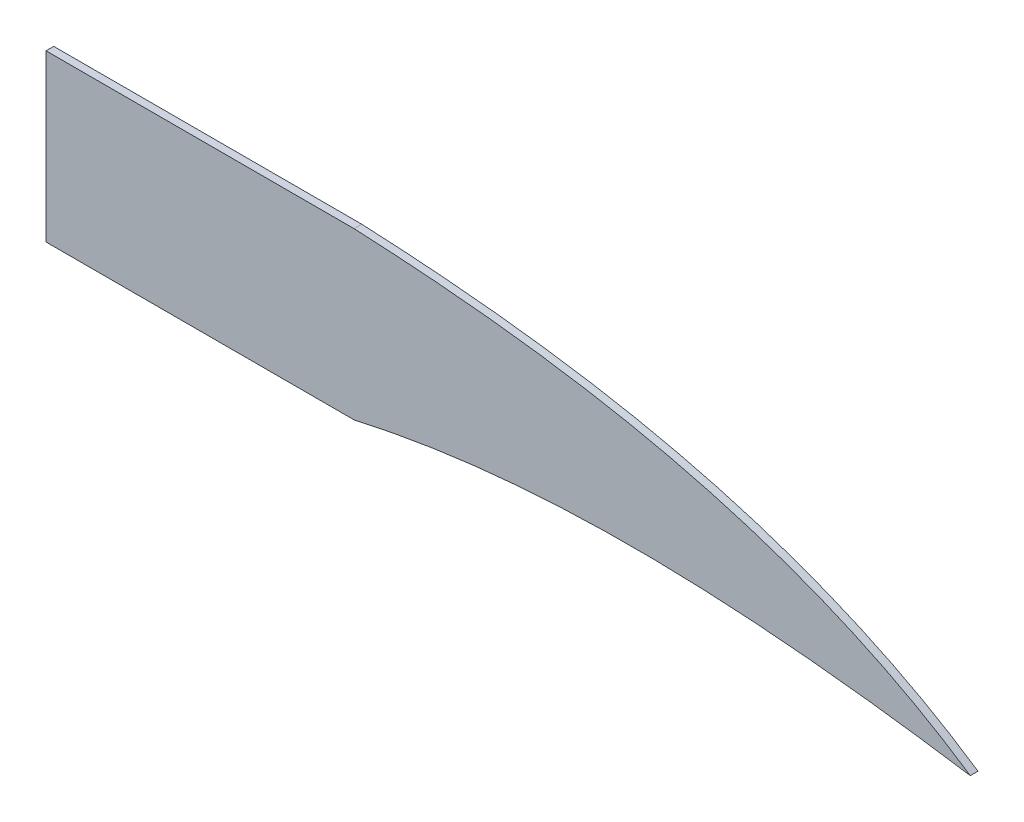
ISO-10303-21;
HEADER;
FILE_DESCRIPTION(('STEP AP214'),'2;1');
FILE_NAME('part.step','',(''),(''),'','','');
FILE_SCHEMA(('AUTOMOTIVE_DESIGN { 1 0 10303 214 1 1 1 1 }'));
ENDSEC;
DATA;
#1=APPLICATION_CONTEXT('core data for automotive mechanical design processes');
#2=APPLICATION_PROTOCOL_DEFINITION('international standard','automotive_design',2000,#1);
#3=PRODUCT_CONTEXT('',#1,'mechanical');
#4=PRODUCT('Part','Part','',(#3));
#5=PRODUCT_RELATED_PRODUCT_CATEGORY('part','',(#4));
#6=PRODUCT_DEFINITION_FORMATION('','',#4);
#7=PRODUCT_DEFINITION_CONTEXT('part definition',#1,'design');
#8=PRODUCT_DEFINITION('design','',#6,#7);
#9=PRODUCT_DEFINITION_SHAPE('','',#8);
#10=(LENGTH_UNIT() NAMED_UNIT(*) SI_UNIT(.MILLI.,.METRE.));
#11=(NAMED_UNIT(*) PLANE_ANGLE_UNIT() SI_UNIT($,.RADIAN.));
#12=(NAMED_UNIT(*) SI_UNIT($,.STERADIAN.) SOLID_ANGLE_UNIT());
#13=UNCERTAINTY_MEASURE_WITH_UNIT(LENGTH_MEASURE(1.E-05),#10,'distance_accuracy_value','');
#14=(GEOMETRIC_REPRESENTATION_CONTEXT(3) GLOBAL_UNCERTAINTY_ASSIGNED_CONTEXT((#13)) GLOBAL_UNIT_ASSIGNED_CONTEXT((#10,
#11,#12)) REPRESENTATION_CONTEXT('',''));
#15=CARTESIAN_POINT('',(0.,0.,0.));
#16=DIRECTION('',(0.,0.,1.));
#17=DIRECTION('',(1.,0.,0.));
#18=AXIS2_PLACEMENT_3D('',#15,#16,#17);
#19=CARTESIAN_POINT('',(-120.,21.5,2.));
#20=DIRECTION('',(1.,0.,0.));
#21=DIRECTION('',(0.,0.,-1.));
#22=AXIS2_PLACEMENT_3D('',#19,#20,#21);
#23=PLANE('',#22);
#24=DIRECTION('',(0.,-1.,0.));
#25=VECTOR('',#24,1.);
#26=CARTESIAN_POINT('',(-120.,21.5,0.));
#27=LINE('',#26,#25);
#28=CARTESIAN_POINT('',(-120.,21.5,0.));
#29=VERTEX_POINT('',#28);
#30=CARTESIAN_POINT('',(-120.,-21.5,0.));
#31=VERTEX_POINT('',#30);
#32=EDGE_CURVE('E134',#29,#31,#27,.T.);
#33=ORIENTED_EDGE('',*,*,#32,.T.);
#34=DIRECTION('',(0.,0.,-1.));
#35=VECTOR('',#34,1.);
#36=CARTESIAN_POINT('',(-120.,-21.5,2.));
#37=LINE('',#36,#35);
#38=CARTESIAN_POINT('',(-120.,-21.5,2.));
#39=VERTEX_POINT('',#38);
#40=EDGE_CURVE('E11',#39,#31,#37,.T.);
#41=ORIENTED_EDGE('',*,*,#40,.F.);
#42=DIRECTION('',(0.,-1.,0.));
#43=VECTOR('',#42,1.);
#44=CARTESIAN_POINT('',(-120.,21.5,2.));
#45=LINE('',#44,#43);
#46=CARTESIAN_POINT('',(-120.,21.5,2.));
#47=VERTEX_POINT('',#46);
#48=EDGE_CURVE('E151',#47,#39,#45,.T.);
#49=ORIENTED_EDGE('',*,*,#48,.F.);
#50=DIRECTION('',(0.,0.,-1.));
#51=VECTOR('',#50,1.);
#52=CARTESIAN_POINT('',(-120.,21.5,2.));
#53=LINE('',#52,#51);
#54=EDGE_CURVE('E103',#47,#29,#53,.T.);
#55=ORIENTED_EDGE('',*,*,#54,.T.);
#56=EDGE_LOOP('',(#33,#41,#49,#55));
#57=FACE_BOUND('',#56,.T.);
#58=ADVANCED_FACE('F33',(#57),#23,.F.);
#59=CARTESIAN_POINT('',(-120.,-21.5,2.));
#60=DIRECTION('',(0.,1.,0.));
#61=DIRECTION('',(-1.,0.,0.));
#62=AXIS2_PLACEMENT_3D('',#59,#60,#61);
#63=PLANE('',#62);
#64=DIRECTION('',(1.,0.,0.));
#65=VECTOR('',#64,1.);
#66=CARTESIAN_POINT('',(-120.,-21.5,0.));
#67=LINE('',#66,#65);
#68=CARTESIAN_POINT('',(-40.,-21.5,0.));
#69=VERTEX_POINT('',#68);
#70=EDGE_CURVE('E129',#31,#69,#67,.T.);
#71=ORIENTED_EDGE('',*,*,#70,.T.);
#72=DIRECTION('',(0.,0.,-1.));
#73=VECTOR('',#72,1.);
#74=CARTESIAN_POINT('',(-40.,-21.5,2.));
#75=LINE('',#74,#73);
#76=CARTESIAN_POINT('',(-40.,-21.5,2.));
#77=VERTEX_POINT('',#76);
#78=EDGE_CURVE('E41',#77,#69,#75,.T.);
#79=ORIENTED_EDGE('',*,*,#78,.F.);
#80=DIRECTION('',(1.,0.,0.));
#81=VECTOR('',#80,1.);
#82=CARTESIAN_POINT('',(-120.,-21.5,2.));
#83=LINE('',#82,#81);
#84=EDGE_CURVE('E83',#39,#77,#83,.T.);
#85=ORIENTED_EDGE('',*,*,#84,.F.);
#86=ORIENTED_EDGE('',*,*,#40,.T.);
#87=EDGE_LOOP('',(#71,#79,#85,#86));
#88=FACE_BOUND('',#87,.T.);
#89=ADVANCED_FACE('F123',(#88),#63,.F.);
#90=CARTESIAN_POINT('',(-40.,-21.5,2.));
#91=CARTESIAN_POINT('',(12.77853939908,-9.52302093039154,2.));
#92=CARTESIAN_POINT('',(67.1413467644261,-13.4062186950975,2.));
#93=CARTESIAN_POINT('',(120.,-21.5,2.));
#94=B_SPLINE_CURVE_WITH_KNOTS('',3,(#90,#91,#92,#93),.UNSPECIFIED.,.F.,.F.,(4,4),(0.,1.),.UNSPECIFIED.);
#95=DIRECTION('',(0.,0.,-1.));
#96=VECTOR('',#95,1.);
#97=SURFACE_OF_LINEAR_EXTRUSION('',#94,#96);
#98=CARTESIAN_POINT('',(-40.,-21.5,0.));
#99=CARTESIAN_POINT('',(12.77853939908,-9.52302093039154,0.));
#100=CARTESIAN_POINT('',(67.1413467644261,-13.4062186950975,0.));
#101=CARTESIAN_POINT('',(120.,-21.5,0.));
#102=B_SPLINE_CURVE_WITH_KNOTS('',3,(#98,#99,#100,#101),.UNSPECIFIED.,.F.,.F.,(4,4),(0.,1.),.UNSPECIFIED.);
#103=CARTESIAN_POINT('',(120.,-21.5,0.));
#104=VERTEX_POINT('',#103);
#105=EDGE_CURVE('E98',#69,#104,#102,.T.);
#106=ORIENTED_EDGE('',*,*,#105,.T.);
#107=DIRECTION('',(0.,0.,-1.));
#108=VECTOR('',#107,1.);
#109=CARTESIAN_POINT('',(120.,-21.5,2.));
#110=LINE('',#109,#108);
#111=CARTESIAN_POINT('',(120.,-21.5,2.));
#112=VERTEX_POINT('',#111);
#113=EDGE_CURVE('E95',#112,#104,#110,.T.);
#114=ORIENTED_EDGE('',*,*,#113,.F.);
#115=EDGE_CURVE('E87',#77,#112,#94,.T.);
#116=ORIENTED_EDGE('',*,*,#115,.F.);
#117=ORIENTED_EDGE('',*,*,#78,.T.);
#118=EDGE_LOOP('',(#106,#114,#116,#117));
#119=FACE_BOUND('',#118,.T.);
#120=ADVANCED_FACE('F96',(#119),#97,.F.);
#121=CARTESIAN_POINT('',(120.,-21.5,2.));
#122=CARTESIAN_POINT('',(73.2532173544596,10.0303460324435,2.));
#123=CARTESIAN_POINT('',(15.0755104247352,18.925789544638,2.));
#124=CARTESIAN_POINT('',(-40.,21.5,2.));
#125=B_SPLINE_CURVE_WITH_KNOTS('',3,(#121,#122,#123,#124),.UNSPECIFIED.,.F.,.F.,(4,4),(0.,1.),.UNSPECIFIED.);
#126=DIRECTION('',(0.,0.,-1.));
#127=VECTOR('',#126,1.);
#128=SURFACE_OF_LINEAR_EXTRUSION('',#125,#127);
#129=CARTESIAN_POINT('',(120.,-21.5,0.));
#130=CARTESIAN_POINT('',(73.2532173544596,10.0303460324435,0.));
#131=CARTESIAN_POINT('',(15.0755104247352,18.925789544638,0.));
#132=CARTESIAN_POINT('',(-40.,21.5,0.));
#133=B_SPLINE_CURVE_WITH_KNOTS('',3,(#129,#130,#131,#132),.UNSPECIFIED.,.F.,.F.,(4,4),(0.,1.),.UNSPECIFIED.);
#134=CARTESIAN_POINT('',(-40.,21.5,0.));
#135=VERTEX_POINT('',#134);
#136=EDGE_CURVE('E69',#104,#135,#133,.T.);
#137=ORIENTED_EDGE('',*,*,#136,.T.);
#138=DIRECTION('',(0.,0.,-1.));
#139=VECTOR('',#138,1.);
#140=CARTESIAN_POINT('',(-40.,21.5,2.));
#141=LINE('',#140,#139);
#142=CARTESIAN_POINT('',(-40.,21.5,2.));
#143=VERTEX_POINT('',#142);
#144=EDGE_CURVE('E99',#143,#135,#141,.T.);
#145=ORIENTED_EDGE('',*,*,#144,.F.);
#146=EDGE_CURVE('E91',#112,#143,#125,.T.);
#147=ORIENTED_EDGE('',*,*,#146,.F.);
#148=ORIENTED_EDGE('',*,*,#113,.T.);
#149=EDGE_LOOP('',(#137,#145,#147,#148));
#150=FACE_BOUND('',#149,.T.);
#151=ADVANCED_FACE('F101',(#150),#128,.F.);
#152=CARTESIAN_POINT('',(-120.,21.5,2.));
#153=DIRECTION('',(0.,-1.,0.));
#154=DIRECTION('',(1.,0.,0.));
#155=AXIS2_PLACEMENT_3D('',#152,#153,#154);
#156=PLANE('',#155);
#157=DIRECTION('',(-1.,0.,0.));
#158=VECTOR('',#157,1.);
#159=CARTESIAN_POINT('',(-120.,21.5,0.));
#160=LINE('',#159,#158);
#161=EDGE_CURVE('E75',#135,#29,#160,.T.);
#162=ORIENTED_EDGE('',*,*,#161,.T.);
#163=ORIENTED_EDGE('',*,*,#54,.F.);
#164=DIRECTION('',(-1.,0.,0.));
#165=VECTOR('',#164,1.);
#166=CARTESIAN_POINT('',(-120.,21.5,2.));
#167=LINE('',#166,#165);
#168=EDGE_CURVE('E49',#143,#47,#167,.T.);
#169=ORIENTED_EDGE('',*,*,#168,.F.);
#170=ORIENTED_EDGE('',*,*,#144,.T.);
#171=EDGE_LOOP('',(#162,#163,#169,#170));
#172=FACE_BOUND('',#171,.T.);
#173=ADVANCED_FACE('F120',(#172),#156,.F.);
#174=CARTESIAN_POINT('',(39.9699573113148,-13.9734648595584,2.));
#175=DIRECTION('',(0.,0.,1.));
#176=DIRECTION('',(1.,0.,0.));
#177=AXIS2_PLACEMENT_3D('',#174,#175,#176);
#178=PLANE('',#177);
#179=ORIENTED_EDGE('',*,*,#48,.T.);
#180=ORIENTED_EDGE('',*,*,#84,.T.);
#181=ORIENTED_EDGE('',*,*,#115,.T.);
#182=ORIENTED_EDGE('',*,*,#146,.T.);
#183=ORIENTED_EDGE('',*,*,#168,.T.);
#184=EDGE_LOOP('',(#179,#180,#181,#182,#183));
#185=FACE_BOUND('',#184,.T.);
#186=ADVANCED_FACE('F89',(#185),#178,.T.);
#187=CARTESIAN_POINT('',(39.9699573113148,-13.9734648595584,0.));
#188=DIRECTION('',(0.,0.,1.));
#189=DIRECTION('',(1.,0.,0.));
#190=AXIS2_PLACEMENT_3D('',#187,#188,#189);
#191=PLANE('',#190);
#192=ORIENTED_EDGE('',*,*,#32,.F.);
#193=ORIENTED_EDGE('',*,*,#161,.F.);
#194=ORIENTED_EDGE('',*,*,#136,.F.);
#195=ORIENTED_EDGE('',*,*,#105,.F.);
#196=ORIENTED_EDGE('',*,*,#70,.F.);
#197=EDGE_LOOP('',(#192,#193,#194,#195,#196));
#198=FACE_BOUND('',#197,.T.);
#199=ADVANCED_FACE('F136',(#198),#191,.F.);
#200=CLOSED_SHELL('',(#58,#89,#120,#151,#173,#186,#199));
#201=MANIFOLD_SOLID_BREP('B2',#200);
#202=ADVANCED_BREP_SHAPE_REPRESENTATION('',(#18,#201),#14);
#203=SHAPE_DEFINITION_REPRESENTATION(#9,#202);
ENDSEC;
END-ISO-10303-21;
